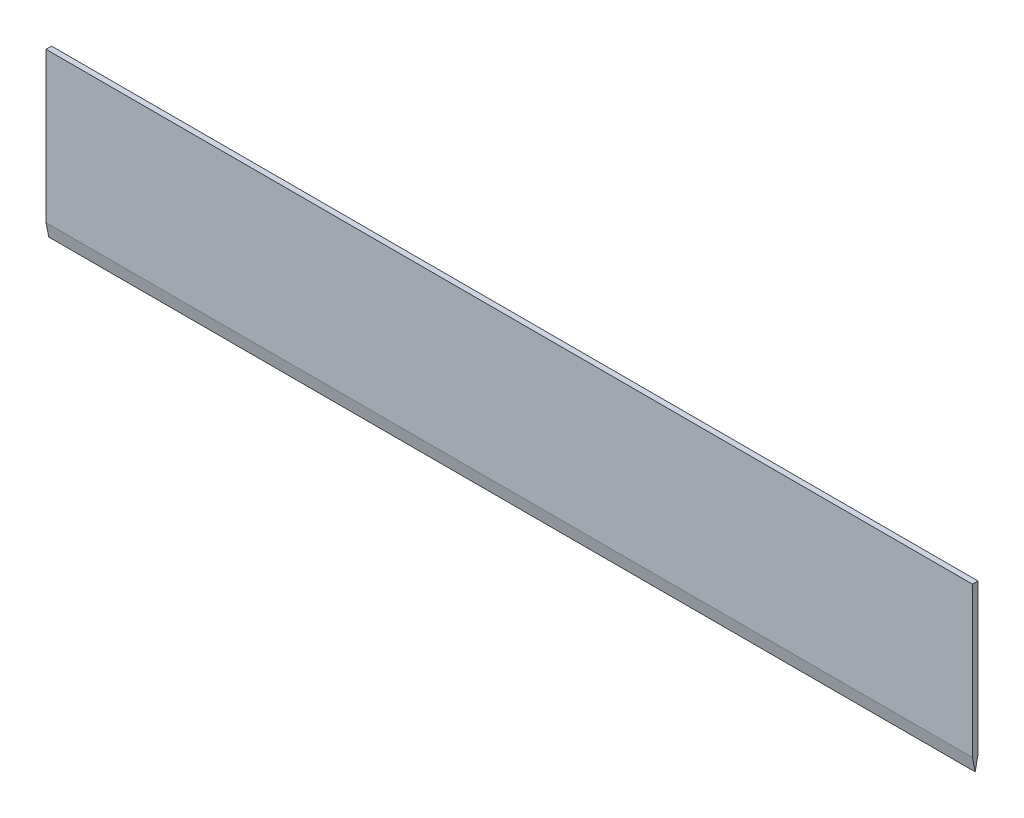
ISO-10303-21;
HEADER;
FILE_DESCRIPTION(('STEP AP214'),'2;1');
FILE_NAME('part.step','',(''),(''),'','','');
FILE_SCHEMA(('AUTOMOTIVE_DESIGN { 1 0 10303 214 1 1 1 1 }'));
ENDSEC;
DATA;
#1=APPLICATION_CONTEXT('core data for automotive mechanical design processes');
#2=APPLICATION_PROTOCOL_DEFINITION('international standard','automotive_design',2000,#1);
#3=PRODUCT_CONTEXT('',#1,'mechanical');
#4=PRODUCT('Part','Part','',(#3));
#5=PRODUCT_RELATED_PRODUCT_CATEGORY('part','',(#4));
#6=PRODUCT_DEFINITION_FORMATION('','',#4);
#7=PRODUCT_DEFINITION_CONTEXT('part definition',#1,'design');
#8=PRODUCT_DEFINITION('design','',#6,#7);
#9=PRODUCT_DEFINITION_SHAPE('','',#8);
#10=(LENGTH_UNIT() NAMED_UNIT(*) SI_UNIT(.MILLI.,.METRE.));
#11=(NAMED_UNIT(*) PLANE_ANGLE_UNIT() SI_UNIT($,.RADIAN.));
#12=(NAMED_UNIT(*) SI_UNIT($,.STERADIAN.) SOLID_ANGLE_UNIT());
#13=UNCERTAINTY_MEASURE_WITH_UNIT(LENGTH_MEASURE(1.E-05),#10,'distance_accuracy_value','');
#14=(GEOMETRIC_REPRESENTATION_CONTEXT(3) GLOBAL_UNCERTAINTY_ASSIGNED_CONTEXT((#13)) GLOBAL_UNIT_ASSIGNED_CONTEXT((#10,
#11,#12)) REPRESENTATION_CONTEXT('',''));
#15=CARTESIAN_POINT('',(0.,0.,0.));
#16=DIRECTION('',(0.,0.,1.));
#17=DIRECTION('',(1.,0.,0.));
#18=AXIS2_PLACEMENT_3D('',#15,#16,#17);
#19=CARTESIAN_POINT('',(-50.,9.,0.6));
#20=DIRECTION('',(1.,0.,0.));
#21=DIRECTION('',(0.,0.,-1.));
#22=AXIS2_PLACEMENT_3D('',#19,#20,#21);
#23=PLANE('',#22);
#24=DIRECTION('',(0.,-1.,0.));
#25=VECTOR('',#24,1.);
#26=CARTESIAN_POINT('',(-50.,9.,0.));
#27=LINE('',#26,#25);
#28=CARTESIAN_POINT('',(-50.,8.7,0.));
#29=VERTEX_POINT('',#28);
#30=CARTESIAN_POINT('',(-50.,-7.5,0.));
#31=VERTEX_POINT('',#30);
#32=EDGE_CURVE('E101',#29,#31,#27,.T.);
#33=ORIENTED_EDGE('',*,*,#32,.T.);
#34=DIRECTION('',(0.,-0.98058067569092,0.196116135138184));
#35=VECTOR('',#34,1.);
#36=CARTESIAN_POINT('',(-50.,-0.288461538461539,-1.44230769230769));
#37=LINE('',#36,#35);
#38=CARTESIAN_POINT('',(-50.,-9.,0.299999999999999));
#39=VERTEX_POINT('',#38);
#40=EDGE_CURVE('E85',#31,#39,#37,.T.);
#41=ORIENTED_EDGE('',*,*,#40,.T.);
#42=DIRECTION('',(0.,0.98058067569092,0.196116135138184));
#43=VECTOR('',#42,1.);
#44=CARTESIAN_POINT('',(-50.,-0.403846153846154,2.01923076923077));
#45=LINE('',#44,#43);
#46=CARTESIAN_POINT('',(-50.,-7.5,0.6));
#47=VERTEX_POINT('',#46);
#48=EDGE_CURVE('E111',#39,#47,#45,.T.);
#49=ORIENTED_EDGE('',*,*,#48,.T.);
#50=DIRECTION('',(0.,-1.,0.));
#51=VECTOR('',#50,1.);
#52=CARTESIAN_POINT('',(-50.,9.,0.6));
#53=LINE('',#52,#51);
#54=CARTESIAN_POINT('',(-50.,8.7,0.6));
#55=VERTEX_POINT('',#54);
#56=EDGE_CURVE('E44',#55,#47,#53,.T.);
#57=ORIENTED_EDGE('',*,*,#56,.F.);
#58=DIRECTION('',(0.,0.,-1.));
#59=VECTOR('',#58,1.);
#60=CARTESIAN_POINT('',(-50.,8.7,0.));
#61=LINE('',#60,#59);
#62=EDGE_CURVE('E106',#55,#29,#61,.T.);
#63=ORIENTED_EDGE('',*,*,#62,.T.);
#64=EDGE_LOOP('',(#33,#41,#49,#57,#63));
#65=FACE_BOUND('',#64,.T.);
#66=ADVANCED_FACE('F36',(#65),#23,.F.);
#67=CARTESIAN_POINT('',(50.,9.,0.6));
#68=DIRECTION('',(-1.,0.,0.));
#69=DIRECTION('',(0.,0.,1.));
#70=AXIS2_PLACEMENT_3D('',#67,#68,#69);
#71=PLANE('',#70);
#72=DIRECTION('',(0.,0.98058067569092,0.196116135138184));
#73=VECTOR('',#72,1.);
#74=CARTESIAN_POINT('',(50.,-0.403846153846154,2.01923076923077));
#75=LINE('',#74,#73);
#76=CARTESIAN_POINT('',(50.,-9.,0.299999999999999));
#77=VERTEX_POINT('',#76);
#78=CARTESIAN_POINT('',(50.,-7.49999999999999,0.6));
#79=VERTEX_POINT('',#78);
#80=EDGE_CURVE('E60',#77,#79,#75,.T.);
#81=ORIENTED_EDGE('',*,*,#80,.F.);
#82=DIRECTION('',(0.,-0.98058067569092,0.196116135138184));
#83=VECTOR('',#82,1.);
#84=CARTESIAN_POINT('',(50.,-0.288461538461539,-1.44230769230769));
#85=LINE('',#84,#83);
#86=CARTESIAN_POINT('',(50.,-7.5,0.));
#87=VERTEX_POINT('',#86);
#88=EDGE_CURVE('E95',#87,#77,#85,.T.);
#89=ORIENTED_EDGE('',*,*,#88,.F.);
#90=DIRECTION('',(0.,1.,0.));
#91=VECTOR('',#90,1.);
#92=CARTESIAN_POINT('',(50.,9.,0.));
#93=LINE('',#92,#91);
#94=CARTESIAN_POINT('',(50.,8.7,0.));
#95=VERTEX_POINT('',#94);
#96=EDGE_CURVE('E39',#87,#95,#93,.T.);
#97=ORIENTED_EDGE('',*,*,#96,.T.);
#98=DIRECTION('',(0.,0.,-1.));
#99=VECTOR('',#98,1.);
#100=CARTESIAN_POINT('',(50.,8.7,0.));
#101=LINE('',#100,#99);
#102=CARTESIAN_POINT('',(50.,8.7,0.6));
#103=VERTEX_POINT('',#102);
#104=EDGE_CURVE('E52',#103,#95,#101,.T.);
#105=ORIENTED_EDGE('',*,*,#104,.F.);
#106=DIRECTION('',(0.,1.,0.));
#107=VECTOR('',#106,1.);
#108=CARTESIAN_POINT('',(50.,9.,0.6));
#109=LINE('',#108,#107);
#110=EDGE_CURVE('E12',#79,#103,#109,.T.);
#111=ORIENTED_EDGE('',*,*,#110,.F.);
#112=EDGE_LOOP('',(#81,#89,#97,#105,#111));
#113=FACE_BOUND('',#112,.T.);
#114=ADVANCED_FACE('F124',(#113),#71,.F.);
#115=CARTESIAN_POINT('',(0.,0.,0.6));
#116=DIRECTION('',(0.,0.,1.));
#117=DIRECTION('',(1.,0.,0.));
#118=AXIS2_PLACEMENT_3D('',#115,#116,#117);
#119=PLANE('',#118);
#120=DIRECTION('',(1.,0.,0.));
#121=VECTOR('',#120,1.);
#122=CARTESIAN_POINT('',(-50.,8.7,0.6));
#123=LINE('',#122,#121);
#124=EDGE_CURVE('E115',#55,#103,#123,.T.);
#125=ORIENTED_EDGE('',*,*,#124,.F.);
#126=ORIENTED_EDGE('',*,*,#56,.T.);
#127=DIRECTION('',(1.,0.,0.));
#128=VECTOR('',#127,1.);
#129=CARTESIAN_POINT('',(-50.,-7.5,0.6));
#130=LINE('',#129,#128);
#131=EDGE_CURVE('E107',#47,#79,#130,.T.);
#132=ORIENTED_EDGE('',*,*,#131,.T.);
#133=ORIENTED_EDGE('',*,*,#110,.T.);
#134=EDGE_LOOP('',(#125,#126,#132,#133));
#135=FACE_BOUND('',#134,.T.);
#136=ADVANCED_FACE('F127',(#135),#119,.T.);
#137=CARTESIAN_POINT('',(0.,0.,0.));
#138=DIRECTION('',(0.,0.,1.));
#139=DIRECTION('',(1.,0.,0.));
#140=AXIS2_PLACEMENT_3D('',#137,#138,#139);
#141=PLANE('',#140);
#142=ORIENTED_EDGE('',*,*,#96,.F.);
#143=DIRECTION('',(1.,0.,0.));
#144=VECTOR('',#143,1.);
#145=CARTESIAN_POINT('',(-50.,-7.5,0.));
#146=LINE('',#145,#144);
#147=EDGE_CURVE('E88',#31,#87,#146,.T.);
#148=ORIENTED_EDGE('',*,*,#147,.F.);
#149=ORIENTED_EDGE('',*,*,#32,.F.);
#150=DIRECTION('',(1.,0.,0.));
#151=VECTOR('',#150,1.);
#152=CARTESIAN_POINT('',(-50.,8.7,0.));
#153=LINE('',#152,#151);
#154=EDGE_CURVE('E117',#29,#95,#153,.T.);
#155=ORIENTED_EDGE('',*,*,#154,.T.);
#156=EDGE_LOOP('',(#142,#148,#149,#155));
#157=FACE_BOUND('',#156,.T.);
#158=ADVANCED_FACE('F100',(#157),#141,.F.);
#159=CARTESIAN_POINT('',(-50.,-0.403846153846154,2.01923076923077));
#160=DIRECTION('',(0.,0.196116135138184,-0.98058067569092));
#161=DIRECTION('',(0.,0.98058067569092,0.196116135138184));
#162=AXIS2_PLACEMENT_3D('',#159,#160,#161);
#163=PLANE('',#162);
#164=ORIENTED_EDGE('',*,*,#80,.T.);
#165=ORIENTED_EDGE('',*,*,#131,.F.);
#166=ORIENTED_EDGE('',*,*,#48,.F.);
#167=DIRECTION('',(1.,0.,0.));
#168=VECTOR('',#167,1.);
#169=CARTESIAN_POINT('',(-50.,-9.,0.299999999999999));
#170=LINE('',#169,#168);
#171=EDGE_CURVE('E90',#39,#77,#170,.T.);
#172=ORIENTED_EDGE('',*,*,#171,.T.);
#173=EDGE_LOOP('',(#164,#165,#166,#172));
#174=FACE_BOUND('',#173,.T.);
#175=ADVANCED_FACE('F122',(#174),#163,.F.);
#176=CARTESIAN_POINT('',(-50.,-0.288461538461539,-1.44230769230769));
#177=DIRECTION('',(0.,0.196116135138184,0.98058067569092));
#178=DIRECTION('',(0.,-0.98058067569092,0.196116135138184));
#179=AXIS2_PLACEMENT_3D('',#176,#177,#178);
#180=PLANE('',#179);
#181=ORIENTED_EDGE('',*,*,#88,.T.);
#182=ORIENTED_EDGE('',*,*,#171,.F.);
#183=ORIENTED_EDGE('',*,*,#40,.F.);
#184=ORIENTED_EDGE('',*,*,#147,.T.);
#185=EDGE_LOOP('',(#181,#182,#183,#184));
#186=FACE_BOUND('',#185,.T.);
#187=ADVANCED_FACE('F87',(#186),#180,.F.);
#188=CARTESIAN_POINT('',(-50.,8.7,0.));
#189=DIRECTION('',(0.,-1.,0.));
#190=DIRECTION('',(0.,0.,-1.));
#191=AXIS2_PLACEMENT_3D('',#188,#189,#190);
#192=PLANE('',#191);
#193=ORIENTED_EDGE('',*,*,#104,.T.);
#194=ORIENTED_EDGE('',*,*,#154,.F.);
#195=ORIENTED_EDGE('',*,*,#62,.F.);
#196=ORIENTED_EDGE('',*,*,#124,.T.);
#197=EDGE_LOOP('',(#193,#194,#195,#196));
#198=FACE_BOUND('',#197,.T.);
#199=ADVANCED_FACE('F128',(#198),#192,.F.);
#200=CLOSED_SHELL('',(#66,#114,#136,#158,#175,#187,#199));
#201=MANIFOLD_SOLID_BREP('B2',#200);
#202=ADVANCED_BREP_SHAPE_REPRESENTATION('',(#18,#201),#14);
#203=SHAPE_DEFINITION_REPRESENTATION(#9,#202);
ENDSEC;
END-ISO-10303-21;
